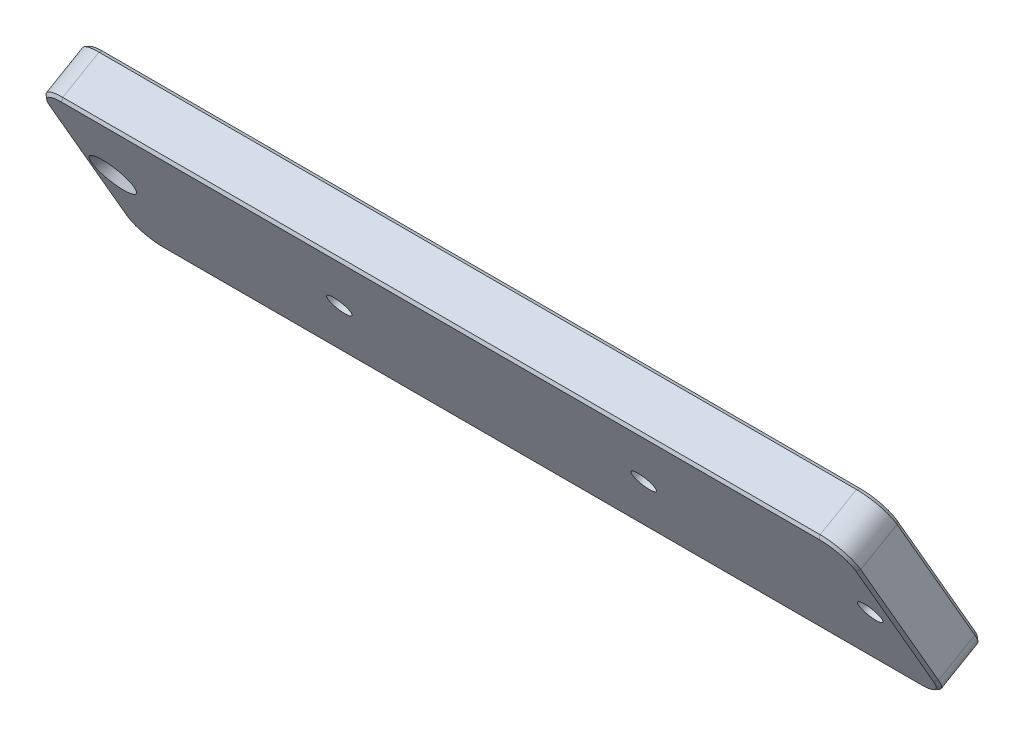
ISO-10303-21;
HEADER;
FILE_DESCRIPTION(('STEP AP214'),'2;1');
FILE_NAME('part.step','',(''),(''),'','','');
FILE_SCHEMA(('AUTOMOTIVE_DESIGN { 1 0 10303 214 1 1 1 1 }'));
ENDSEC;
DATA;
#1=APPLICATION_CONTEXT('core data for automotive mechanical design processes');
#2=APPLICATION_PROTOCOL_DEFINITION('international standard','automotive_design',2000,#1);
#3=PRODUCT_CONTEXT('',#1,'mechanical');
#4=PRODUCT('Part','Part','',(#3));
#5=PRODUCT_RELATED_PRODUCT_CATEGORY('part','',(#4));
#6=PRODUCT_DEFINITION_FORMATION('','',#4);
#7=PRODUCT_DEFINITION_CONTEXT('part definition',#1,'design');
#8=PRODUCT_DEFINITION('design','',#6,#7);
#9=PRODUCT_DEFINITION_SHAPE('','',#8);
#10=(LENGTH_UNIT() NAMED_UNIT(*) SI_UNIT(.MILLI.,.METRE.));
#11=(NAMED_UNIT(*) PLANE_ANGLE_UNIT() SI_UNIT($,.RADIAN.));
#12=(NAMED_UNIT(*) SI_UNIT($,.STERADIAN.) SOLID_ANGLE_UNIT());
#13=UNCERTAINTY_MEASURE_WITH_UNIT(LENGTH_MEASURE(1.E-05),#10,'distance_accuracy_value','');
#14=(GEOMETRIC_REPRESENTATION_CONTEXT(3) GLOBAL_UNCERTAINTY_ASSIGNED_CONTEXT((#13)) GLOBAL_UNIT_ASSIGNED_CONTEXT((#10,
#11,#12)) REPRESENTATION_CONTEXT('',''));
#15=CARTESIAN_POINT('',(0.,0.,0.));
#16=DIRECTION('',(0.,0.,1.));
#17=DIRECTION('',(1.,0.,0.));
#18=AXIS2_PLACEMENT_3D('',#15,#16,#17);
#19=CARTESIAN_POINT('',(-56.,48.490707856479,74.614170676043));
#20=DIRECTION('',(0.,-0.50000000000019,0.866025403784329));
#21=DIRECTION('',(0.,-0.866025403784329,-0.50000000000019));
#22=AXIS2_PLACEMENT_3D('',#19,#20,#21);
#23=CYLINDRICAL_SURFACE('',#22,4.);
#24=DIRECTION('',(0.,-0.50000000000019,0.866025403784329));
#25=VECTOR('',#24,1.);
#26=CARTESIAN_POINT('',(-56.,45.026606241341,72.614170676043));
#27=LINE('',#26,#25);
#28=CARTESIAN_POINT('',(-56.,44.826606241341,72.960580837557));
#29=VERTEX_POINT('',#28);
#30=CARTESIAN_POINT('',(-56.,41.7266062413414,78.3299383410167));
#31=VERTEX_POINT('',#30);
#32=EDGE_CURVE('E471',#29,#31,#27,.T.);
#33=ORIENTED_EDGE('',*,*,#32,.T.);
#34=CARTESIAN_POINT('',(-56.,45.1907078564789,80.3299383410176));
#35=DIRECTION('',(0.,-0.50000000000019,0.866025403784329));
#36=DIRECTION('',(0.,-0.866025403784329,-0.50000000000019));
#37=AXIS2_PLACEMENT_3D('',#34,#35,#36);
#38=CIRCLE('',#37,4.);
#39=CARTESIAN_POINT('',(-60.,45.1907078564789,80.3299383410176));
#40=VERTEX_POINT('',#39);
#41=EDGE_CURVE('E412',#31,#40,#38,.F.);
#42=ORIENTED_EDGE('',*,*,#41,.T.);
#43=DIRECTION('',(0.,-0.50000000000019,0.866025403784329));
#44=VECTOR('',#43,1.);
#45=CARTESIAN_POINT('',(-60.,48.490707856479,74.614170676043));
#46=LINE('',#45,#44);
#47=CARTESIAN_POINT('',(-60.,48.290707856479,74.960580837557));
#48=VERTEX_POINT('',#47);
#49=EDGE_CURVE('E479',#48,#40,#46,.T.);
#50=ORIENTED_EDGE('',*,*,#49,.F.);
#51=CARTESIAN_POINT('',(-56.,48.290707856479,74.960580837557));
#52=DIRECTION('',(0.,-0.50000000000019,0.866025403784329));
#53=DIRECTION('',(-1.,0.,0.));
#54=AXIS2_PLACEMENT_3D('',#51,#52,#53);
#55=CIRCLE('',#54,4.);
#56=EDGE_CURVE('E484',#48,#29,#55,.T.);
#57=ORIENTED_EDGE('',*,*,#56,.T.);
#58=EDGE_LOOP('',(#33,#42,#50,#57));
#59=FACE_BOUND('',#58,.T.);
#60=ADVANCED_FACE('F59',(#59),#23,.T.);
#61=CARTESIAN_POINT('',(-60.,71.873393758659,88.114170676043));
#62=DIRECTION('',(1.,0.,0.));
#63=DIRECTION('',(0.,1.,0.));
#64=AXIS2_PLACEMENT_3D('',#61,#62,#63);
#65=PLANE('',#64);
#66=ORIENTED_EDGE('',*,*,#49,.T.);
#67=DIRECTION('',(0.,0.866025403784329,0.50000000000019));
#68=VECTOR('',#67,1.);
#69=CARTESIAN_POINT('',(-60.,65.1092921435184,91.8299383410219));
#70=LINE('',#69,#68);
#71=CARTESIAN_POINT('',(-60.,65.1092921435184,91.8299383410219));
#72=VERTEX_POINT('',#71);
#73=EDGE_CURVE('E406',#40,#72,#70,.T.);
#74=ORIENTED_EDGE('',*,*,#73,.T.);
#75=DIRECTION('',(0.,-0.50000000000019,0.866025403784329));
#76=VECTOR('',#75,1.);
#77=CARTESIAN_POINT('',(-60.,68.409292143521,86.114170676043));
#78=LINE('',#77,#76);
#79=CARTESIAN_POINT('',(-60.,68.209292143521,86.460580837557));
#80=VERTEX_POINT('',#79);
#81=EDGE_CURVE('E290',#80,#72,#78,.T.);
#82=ORIENTED_EDGE('',*,*,#81,.F.);
#83=DIRECTION('',(0.,-0.866025403784329,-0.50000000000019));
#84=VECTOR('',#83,1.);
#85=CARTESIAN_POINT('',(-60.,68.209292143521,86.460580837557));
#86=LINE('',#85,#84);
#87=EDGE_CURVE('E287',#80,#48,#86,.T.);
#88=ORIENTED_EDGE('',*,*,#87,.T.);
#89=EDGE_LOOP('',(#66,#74,#82,#88));
#90=FACE_BOUND('',#89,.T.);
#91=ADVANCED_FACE('F533',(#90),#65,.F.);
#92=CARTESIAN_POINT('',(-56.,68.409292143521,86.114170676043));
#93=DIRECTION('',(0.,-0.50000000000019,0.866025403784329));
#94=DIRECTION('',(0.,0.866025403784329,0.50000000000019));
#95=AXIS2_PLACEMENT_3D('',#92,#93,#94);
#96=CYLINDRICAL_SURFACE('',#95,4.);
#97=ORIENTED_EDGE('',*,*,#81,.T.);
#98=CARTESIAN_POINT('',(-56.,65.1092921435184,91.8299383410219));
#99=DIRECTION('',(0.,-0.500000000000203,0.866025403784321));
#100=DIRECTION('',(0.,-0.866025403784321,-0.500000000000203));
#101=AXIS2_PLACEMENT_3D('',#98,#99,#100);
#102=CIRCLE('',#101,4.);
#103=CARTESIAN_POINT('',(-56.,68.5733937586559,93.8299383410228));
#104=VERTEX_POINT('',#103);
#105=EDGE_CURVE('E400',#72,#104,#102,.F.);
#106=ORIENTED_EDGE('',*,*,#105,.T.);
#107=DIRECTION('',(0.,-0.50000000000019,0.866025403784329));
#108=VECTOR('',#107,1.);
#109=CARTESIAN_POINT('',(-56.,71.873393758659,88.114170676043));
#110=LINE('',#109,#108);
#111=CARTESIAN_POINT('',(-56.,71.673393758659,88.460580837557));
#112=VERTEX_POINT('',#111);
#113=EDGE_CURVE('E339',#112,#104,#110,.T.);
#114=ORIENTED_EDGE('',*,*,#113,.F.);
#115=CARTESIAN_POINT('',(-56.,68.209292143521,86.460580837557));
#116=DIRECTION('',(0.,-0.50000000000019,0.866025403784329));
#117=DIRECTION('',(0.,0.866025403784329,0.50000000000019));
#118=AXIS2_PLACEMENT_3D('',#115,#116,#117);
#119=CIRCLE('',#118,4.);
#120=EDGE_CURVE('E238',#112,#80,#119,.T.);
#121=ORIENTED_EDGE('',*,*,#120,.T.);
#122=EDGE_LOOP('',(#97,#106,#114,#121));
#123=FACE_BOUND('',#122,.T.);
#124=ADVANCED_FACE('F540',(#123),#96,.T.);
#125=CARTESIAN_POINT('',(60.,71.873393758659,88.114170676043));
#126=DIRECTION('',(0.,-0.866025403784329,-0.50000000000019));
#127=DIRECTION('',(0.,0.50000000000019,-0.866025403784329));
#128=AXIS2_PLACEMENT_3D('',#125,#126,#127);
#129=PLANE('',#128);
#130=ORIENTED_EDGE('',*,*,#113,.T.);
#131=DIRECTION('',(1.,0.,0.));
#132=VECTOR('',#131,1.);
#133=CARTESIAN_POINT('',(56.,68.5733937586559,93.8299383410227));
#134=LINE('',#133,#132);
#135=CARTESIAN_POINT('',(56.,68.5733937586559,93.8299383410228));
#136=VERTEX_POINT('',#135);
#137=EDGE_CURVE('E361',#104,#136,#134,.T.);
#138=ORIENTED_EDGE('',*,*,#137,.T.);
#139=DIRECTION('',(0.,-0.50000000000019,0.866025403784329));
#140=VECTOR('',#139,1.);
#141=CARTESIAN_POINT('',(56.,71.873393758659,88.114170676043));
#142=LINE('',#141,#140);
#143=CARTESIAN_POINT('',(56.,71.673393758659,88.460580837557));
#144=VERTEX_POINT('',#143);
#145=EDGE_CURVE('E357',#144,#136,#142,.T.);
#146=ORIENTED_EDGE('',*,*,#145,.F.);
#147=DIRECTION('',(-1.,0.,0.));
#148=VECTOR('',#147,1.);
#149=CARTESIAN_POINT('',(56.,71.673393758659,88.460580837557));
#150=LINE('',#149,#148);
#151=EDGE_CURVE('E275',#144,#112,#150,.T.);
#152=ORIENTED_EDGE('',*,*,#151,.T.);
#153=EDGE_LOOP('',(#130,#138,#146,#152));
#154=FACE_BOUND('',#153,.T.);
#155=ADVANCED_FACE('F558',(#154),#129,.F.);
#156=CARTESIAN_POINT('',(56.,68.409292143521,86.114170676043));
#157=DIRECTION('',(0.,-0.50000000000019,0.866025403784329));
#158=DIRECTION('',(1.,0.,0.));
#159=AXIS2_PLACEMENT_3D('',#156,#157,#158);
#160=CYLINDRICAL_SURFACE('',#159,4.);
#161=ORIENTED_EDGE('',*,*,#145,.T.);
#162=CARTESIAN_POINT('',(56.,65.1092921435184,91.8299383410219));
#163=DIRECTION('',(0.,-0.500000000000203,0.866025403784321));
#164=DIRECTION('',(0.,-0.866025403784321,-0.500000000000203));
#165=AXIS2_PLACEMENT_3D('',#162,#163,#164);
#166=CIRCLE('',#165,4.);
#167=CARTESIAN_POINT('',(60.,65.1092921435184,91.8299383410219));
#168=VERTEX_POINT('',#167);
#169=EDGE_CURVE('E403',#136,#168,#166,.F.);
#170=ORIENTED_EDGE('',*,*,#169,.T.);
#171=DIRECTION('',(0.,-0.50000000000019,0.866025403784329));
#172=VECTOR('',#171,1.);
#173=CARTESIAN_POINT('',(60.,68.409292143521,86.114170676043));
#174=LINE('',#173,#172);
#175=CARTESIAN_POINT('',(60.,68.209292143521,86.460580837557));
#176=VERTEX_POINT('',#175);
#177=EDGE_CURVE('E331',#176,#168,#174,.T.);
#178=ORIENTED_EDGE('',*,*,#177,.F.);
#179=CARTESIAN_POINT('',(56.,68.209292143521,86.460580837557));
#180=DIRECTION('',(0.,-0.50000000000019,0.866025403784329));
#181=DIRECTION('',(1.,0.,0.));
#182=AXIS2_PLACEMENT_3D('',#179,#180,#181);
#183=CIRCLE('',#182,4.);
#184=EDGE_CURVE('E233',#176,#144,#183,.T.);
#185=ORIENTED_EDGE('',*,*,#184,.T.);
#186=EDGE_LOOP('',(#161,#170,#178,#185));
#187=FACE_BOUND('',#186,.T.);
#188=ADVANCED_FACE('F554',(#187),#160,.T.);
#189=CARTESIAN_POINT('',(60.,45.026606241341,72.614170676043));
#190=DIRECTION('',(-1.,0.,0.));
#191=DIRECTION('',(0.,0.,1.));
#192=AXIS2_PLACEMENT_3D('',#189,#190,#191);
#193=PLANE('',#192);
#194=ORIENTED_EDGE('',*,*,#177,.T.);
#195=DIRECTION('',(0.,-0.866025403784329,-0.50000000000019));
#196=VECTOR('',#195,1.);
#197=CARTESIAN_POINT('',(60.,45.1907078564789,80.3299383410176));
#198=LINE('',#197,#196);
#199=CARTESIAN_POINT('',(60.,45.1907078564789,80.3299383410175));
#200=VERTEX_POINT('',#199);
#201=EDGE_CURVE('E409',#168,#200,#198,.T.);
#202=ORIENTED_EDGE('',*,*,#201,.T.);
#203=DIRECTION('',(0.,-0.50000000000019,0.866025403784329));
#204=VECTOR('',#203,1.);
#205=CARTESIAN_POINT('',(60.,48.490707856479,74.614170676043));
#206=LINE('',#205,#204);
#207=CARTESIAN_POINT('',(60.,48.290707856479,74.960580837557));
#208=VERTEX_POINT('',#207);
#209=EDGE_CURVE('E279',#208,#200,#206,.T.);
#210=ORIENTED_EDGE('',*,*,#209,.F.);
#211=DIRECTION('',(0.,0.866025403784329,0.50000000000019));
#212=VECTOR('',#211,1.);
#213=CARTESIAN_POINT('',(60.,48.290707856479,74.960580837557));
#214=LINE('',#213,#212);
#215=EDGE_CURVE('E327',#208,#176,#214,.T.);
#216=ORIENTED_EDGE('',*,*,#215,.T.);
#217=EDGE_LOOP('',(#194,#202,#210,#216));
#218=FACE_BOUND('',#217,.T.);
#219=ADVANCED_FACE('F551',(#218),#193,.F.);
#220=CARTESIAN_POINT('',(56.,48.490707856479,74.614170676043));
#221=DIRECTION('',(0.,-0.50000000000019,0.866025403784329));
#222=DIRECTION('',(0.,-0.866025403784329,-0.50000000000019));
#223=AXIS2_PLACEMENT_3D('',#220,#221,#222);
#224=CYLINDRICAL_SURFACE('',#223,4.);
#225=ORIENTED_EDGE('',*,*,#209,.T.);
#226=CARTESIAN_POINT('',(56.,45.1907078564789,80.3299383410176));
#227=DIRECTION('',(0.,-0.50000000000019,0.866025403784329));
#228=DIRECTION('',(0.,-0.866025403784329,-0.50000000000019));
#229=AXIS2_PLACEMENT_3D('',#226,#227,#228);
#230=CIRCLE('',#229,4.);
#231=CARTESIAN_POINT('',(56.,41.7266062413414,78.3299383410167));
#232=VERTEX_POINT('',#231);
#233=EDGE_CURVE('E70',#200,#232,#230,.F.);
#234=ORIENTED_EDGE('',*,*,#233,.T.);
#235=DIRECTION('',(0.,-0.50000000000019,0.866025403784329));
#236=VECTOR('',#235,1.);
#237=CARTESIAN_POINT('',(56.,45.026606241341,72.614170676043));
#238=LINE('',#237,#236);
#239=CARTESIAN_POINT('',(56.,44.826606241341,72.960580837557));
#240=VERTEX_POINT('',#239);
#241=EDGE_CURVE('E468',#240,#232,#238,.T.);
#242=ORIENTED_EDGE('',*,*,#241,.F.);
#243=CARTESIAN_POINT('',(56.,48.290707856479,74.960580837557));
#244=DIRECTION('',(0.,-0.50000000000019,0.866025403784329));
#245=DIRECTION('',(0.,-0.866025403784329,-0.50000000000019));
#246=AXIS2_PLACEMENT_3D('',#243,#244,#245);
#247=CIRCLE('',#246,4.);
#248=EDGE_CURVE('E269',#240,#208,#247,.T.);
#249=ORIENTED_EDGE('',*,*,#248,.T.);
#250=EDGE_LOOP('',(#225,#234,#242,#249));
#251=FACE_BOUND('',#250,.T.);
#252=ADVANCED_FACE('F548',(#251),#224,.T.);
#253=CARTESIAN_POINT('',(-60.,45.026606241341,72.614170676043));
#254=DIRECTION('',(0.,0.866025403784329,0.50000000000019));
#255=DIRECTION('',(1.,0.,0.));
#256=AXIS2_PLACEMENT_3D('',#253,#254,#255);
#257=PLANE('',#256);
#258=ORIENTED_EDGE('',*,*,#241,.T.);
#259=DIRECTION('',(-1.,0.,0.));
#260=VECTOR('',#259,1.);
#261=CARTESIAN_POINT('',(-56.,41.7266062413414,78.3299383410167));
#262=LINE('',#261,#260);
#263=EDGE_CURVE('E12',#232,#31,#262,.T.);
#264=ORIENTED_EDGE('',*,*,#263,.T.);
#265=ORIENTED_EDGE('',*,*,#32,.F.);
#266=DIRECTION('',(1.,0.,0.));
#267=VECTOR('',#266,1.);
#268=CARTESIAN_POINT('',(-56.,44.826606241341,72.960580837557));
#269=LINE('',#268,#267);
#270=EDGE_CURVE('E465',#29,#240,#269,.T.);
#271=ORIENTED_EDGE('',*,*,#270,.T.);
#272=EDGE_LOOP('',(#258,#264,#265,#271));
#273=FACE_BOUND('',#272,.T.);
#274=ADVANCED_FACE('F546',(#273),#257,.F.);
#275=CARTESIAN_POINT('',(22.5,58.45,80.364170676043));
#276=DIRECTION('',(0.,-0.50000000000019,0.866025403784329));
#277=DIRECTION('',(-1.,0.,0.));
#278=AXIS2_PLACEMENT_3D('',#275,#276,#277);
#279=CYLINDRICAL_SURFACE('',#278,1.7);
#280=DIRECTION('',(0.,-0.50000000000019,0.866025403784329));
#281=VECTOR('',#280,1.);
#282=CARTESIAN_POINT('',(20.8,58.45,80.364170676043));
#283=LINE('',#282,#281);
#284=CARTESIAN_POINT('',(20.8,57.65,81.749811322098));
#285=VERTEX_POINT('',#284);
#286=CARTESIAN_POINT('',(20.8,54.9499999999986,86.4263485025335));
#287=VERTEX_POINT('',#286);
#288=EDGE_CURVE('E356',#285,#287,#283,.T.);
#289=ORIENTED_EDGE('',*,*,#288,.T.);
#290=CARTESIAN_POINT('',(22.5,54.9499999999986,86.4263485025335));
#291=DIRECTION('',(0.,-0.50000000000019,0.866025403784329));
#292=DIRECTION('',(0.,-0.866025403784329,-0.50000000000019));
#293=AXIS2_PLACEMENT_3D('',#290,#291,#292);
#294=CIRCLE('',#293,1.7);
#295=EDGE_CURVE('E365',#287,#287,#294,.T.);
#296=ORIENTED_EDGE('',*,*,#295,.T.);
#297=ORIENTED_EDGE('',*,*,#288,.F.);
#298=CARTESIAN_POINT('',(22.5,57.65,81.749811322098));
#299=DIRECTION('',(0.,-0.50000000000019,0.866025403784329));
#300=DIRECTION('',(0.,-0.866025403784329,-0.50000000000019));
#301=AXIS2_PLACEMENT_3D('',#298,#299,#300);
#302=CIRCLE('',#301,1.7);
#303=EDGE_CURVE('E326',#285,#285,#302,.T.);
#304=ORIENTED_EDGE('',*,*,#303,.F.);
#305=EDGE_LOOP('',(#289,#296,#297,#304));
#306=FACE_BOUND('',#305,.T.);
#307=ADVANCED_FACE('F544',(#306),#279,.F.);
#308=CARTESIAN_POINT('',(-22.5,58.45,80.364170676043));
#309=DIRECTION('',(0.,-0.50000000000019,0.866025403784329));
#310=DIRECTION('',(-1.,0.,0.));
#311=AXIS2_PLACEMENT_3D('',#308,#309,#310);
#312=CYLINDRICAL_SURFACE('',#311,1.7);
#313=DIRECTION('',(0.,-0.50000000000019,0.866025403784329));
#314=VECTOR('',#313,1.);
#315=CARTESIAN_POINT('',(-24.2,58.45,80.364170676043));
#316=LINE('',#315,#314);
#317=CARTESIAN_POINT('',(-24.2,57.65,81.749811322098));
#318=VERTEX_POINT('',#317);
#319=CARTESIAN_POINT('',(-24.2,54.9499999999986,86.4263485025335));
#320=VERTEX_POINT('',#319);
#321=EDGE_CURVE('E325',#318,#320,#316,.T.);
#322=ORIENTED_EDGE('',*,*,#321,.T.);
#323=CARTESIAN_POINT('',(-22.5,54.9499999999986,86.4263485025335));
#324=DIRECTION('',(0.,-0.50000000000019,0.866025403784329));
#325=DIRECTION('',(0.,-0.866025403784329,-0.50000000000019));
#326=AXIS2_PLACEMENT_3D('',#323,#324,#325);
#327=CIRCLE('',#326,1.7);
#328=EDGE_CURVE('E314',#320,#320,#327,.T.);
#329=ORIENTED_EDGE('',*,*,#328,.T.);
#330=ORIENTED_EDGE('',*,*,#321,.F.);
#331=CARTESIAN_POINT('',(-22.5,57.65,81.749811322098));
#332=DIRECTION('',(0.,-0.50000000000019,0.866025403784329));
#333=DIRECTION('',(0.,-0.866025403784329,-0.50000000000019));
#334=AXIS2_PLACEMENT_3D('',#331,#332,#333);
#335=CIRCLE('',#334,1.7);
#336=EDGE_CURVE('E274',#318,#318,#335,.T.);
#337=ORIENTED_EDGE('',*,*,#336,.F.);
#338=EDGE_LOOP('',(#322,#329,#330,#337));
#339=FACE_BOUND('',#338,.T.);
#340=ADVANCED_FACE('F511',(#339),#312,.F.);
#341=CARTESIAN_POINT('',(56.,56.45,83.828272291181));
#342=DIRECTION('',(0.,0.50000000000019,-0.866025403784329));
#343=DIRECTION('',(-1.,0.,0.));
#344=AXIS2_PLACEMENT_3D('',#341,#342,#343);
#345=CYLINDRICAL_SURFACE('',#344,1.7);
#346=DIRECTION('',(0.,0.50000000000019,-0.866025403784329));
#347=VECTOR('',#346,1.);
#348=CARTESIAN_POINT('',(54.3,56.45,83.828272291181));
#349=LINE('',#348,#347);
#350=CARTESIAN_POINT('',(54.3,54.9499999999994,86.426348502534));
#351=VERTEX_POINT('',#350);
#352=CARTESIAN_POINT('',(54.3,58.45,80.364170676043));
#353=VERTEX_POINT('',#352);
#354=EDGE_CURVE('E322',#351,#353,#349,.T.);
#355=ORIENTED_EDGE('',*,*,#354,.F.);
#356=CARTESIAN_POINT('',(56.,54.9499999999994,86.426348502534));
#357=DIRECTION('',(0.,-0.50000000000019,0.866025403784329));
#358=DIRECTION('',(0.,-0.866025403784329,-0.50000000000019));
#359=AXIS2_PLACEMENT_3D('',#356,#357,#358);
#360=CIRCLE('',#359,1.7);
#361=EDGE_CURVE('E332',#351,#351,#360,.F.);
#362=ORIENTED_EDGE('',*,*,#361,.F.);
#363=ORIENTED_EDGE('',*,*,#354,.T.);
#364=CARTESIAN_POINT('',(56.,58.45,80.364170676043));
#365=DIRECTION('',(0.,0.50000000000019,-0.866025403784329));
#366=DIRECTION('',(-1.,0.,0.));
#367=AXIS2_PLACEMENT_3D('',#364,#365,#366);
#368=CIRCLE('',#367,1.7);
#369=EDGE_CURVE('E308',#353,#353,#368,.T.);
#370=ORIENTED_EDGE('',*,*,#369,.T.);
#371=EDGE_LOOP('',(#355,#362,#363,#370));
#372=FACE_BOUND('',#371,.T.);
#373=ADVANCED_FACE('F679',(#372),#345,.F.);
#374=CARTESIAN_POINT('',(22.5,58.45,80.364170676043));
#375=DIRECTION('',(0.,0.50000000000019,-0.866025403784329));
#376=DIRECTION('',(-1.,0.,0.));
#377=AXIS2_PLACEMENT_3D('',#374,#375,#376);
#378=CONICAL_SURFACE('',#377,3.3,0.785398163397);
#379=DIRECTION('',(0.707106781186753,-0.353553390592877,0.612372435695786));
#380=VECTOR('',#379,1.);
#381=CARTESIAN_POINT('',(19.2,58.45,80.364170676043));
#382=LINE('',#381,#380);
#383=CARTESIAN_POINT('',(19.2,58.45,80.364170676043));
#384=VERTEX_POINT('',#383);
#385=EDGE_CURVE('E318',#384,#285,#382,.T.);
#386=ORIENTED_EDGE('',*,*,#385,.F.);
#387=CARTESIAN_POINT('',(22.5,58.45,80.364170676043));
#388=DIRECTION('',(0.,-0.50000000000019,0.866025403784329));
#389=DIRECTION('',(-1.,0.,0.));
#390=AXIS2_PLACEMENT_3D('',#387,#388,#389);
#391=CIRCLE('',#390,3.3);
#392=EDGE_CURVE('E304',#384,#384,#391,.T.);
#393=ORIENTED_EDGE('',*,*,#392,.F.);
#394=ORIENTED_EDGE('',*,*,#385,.T.);
#395=ORIENTED_EDGE('',*,*,#303,.T.);
#396=EDGE_LOOP('',(#386,#393,#394,#395));
#397=FACE_BOUND('',#396,.T.);
#398=ADVANCED_FACE('F497',(#397),#378,.F.);
#399=CARTESIAN_POINT('',(-22.5,58.45,80.364170676043));
#400=DIRECTION('',(0.,0.50000000000019,-0.866025403784329));
#401=DIRECTION('',(-1.,0.,0.));
#402=AXIS2_PLACEMENT_3D('',#399,#400,#401);
#403=CONICAL_SURFACE('',#402,3.3,0.785398163397);
#404=DIRECTION('',(0.707106781186753,-0.353553390592877,0.612372435695786));
#405=VECTOR('',#404,1.);
#406=CARTESIAN_POINT('',(-25.8,58.45,80.364170676043));
#407=LINE('',#406,#405);
#408=CARTESIAN_POINT('',(-25.8,58.45,80.364170676043));
#409=VERTEX_POINT('',#408);
#410=EDGE_CURVE('E270',#409,#318,#407,.T.);
#411=ORIENTED_EDGE('',*,*,#410,.F.);
#412=CARTESIAN_POINT('',(-22.5,58.45,80.364170676043));
#413=DIRECTION('',(0.,-0.50000000000019,0.866025403784329));
#414=DIRECTION('',(-1.,0.,0.));
#415=AXIS2_PLACEMENT_3D('',#412,#413,#414);
#416=CIRCLE('',#415,3.3);
#417=EDGE_CURVE('E293',#409,#409,#416,.T.);
#418=ORIENTED_EDGE('',*,*,#417,.F.);
#419=ORIENTED_EDGE('',*,*,#410,.T.);
#420=ORIENTED_EDGE('',*,*,#336,.T.);
#421=EDGE_LOOP('',(#411,#418,#419,#420));
#422=FACE_BOUND('',#421,.T.);
#423=ADVANCED_FACE('F508',(#422),#403,.F.);
#424=CARTESIAN_POINT('',(56.,71.600188677902,88.1873757568));
#425=DIRECTION('',(0.,0.965925826288944,-0.258819045102985));
#426=DIRECTION('',(-1.,0.,0.));
#427=AXIS2_PLACEMENT_3D('',#424,#425,#426);
#428=PLANE('',#427);
#429=DIRECTION('',(-1.,0.,0.));
#430=VECTOR('',#429,1.);
#431=CARTESIAN_POINT('',(56.,71.526983597145,87.914170676043));
#432=LINE('',#431,#430);
#433=CARTESIAN_POINT('',(56.,71.526983597145,87.914170676043));
#434=VERTEX_POINT('',#433);
#435=CARTESIAN_POINT('',(-56.,71.526983597145,87.914170676043));
#436=VERTEX_POINT('',#435);
#437=EDGE_CURVE('E254',#434,#436,#432,.T.);
#438=ORIENTED_EDGE('',*,*,#437,.T.);
#439=DIRECTION('',(0.,-0.258819045102985,-0.965925826288944));
#440=VECTOR('',#439,1.);
#441=CARTESIAN_POINT('',(-56.,71.600188677902,88.1873757568));
#442=LINE('',#441,#440);
#443=EDGE_CURVE('E237',#112,#436,#442,.T.);
#444=ORIENTED_EDGE('',*,*,#443,.F.);
#445=ORIENTED_EDGE('',*,*,#151,.F.);
#446=DIRECTION('',(0.,-0.258819045102985,-0.965925826288944));
#447=VECTOR('',#446,1.);
#448=CARTESIAN_POINT('',(56.,71.673393758659,88.460580837557));
#449=LINE('',#448,#447);
#450=EDGE_CURVE('E319',#144,#434,#449,.T.);
#451=ORIENTED_EDGE('',*,*,#450,.T.);
#452=EDGE_LOOP('',(#438,#444,#445,#451));
#453=FACE_BOUND('',#452,.T.);
#454=ADVANCED_FACE('F590',(#453),#428,.T.);
#455=CARTESIAN_POINT('',(56.,68.209292143521,86.460580837557));
#456=DIRECTION('',(0.,-0.50000000000019,0.866025403784329));
#457=DIRECTION('',(1.,0.,0.));
#458=AXIS2_PLACEMENT_3D('',#455,#456,#457);
#459=CONICAL_SURFACE('',#458,4.,0.785398163397);
#460=CARTESIAN_POINT('',(56.,68.409292143521,86.114170676043));
#461=DIRECTION('',(0.,-0.50000000000019,0.866025403784329));
#462=DIRECTION('',(1.,0.,0.));
#463=AXIS2_PLACEMENT_3D('',#460,#461,#462);
#464=CIRCLE('',#463,3.6);
#465=CARTESIAN_POINT('',(59.6,68.409292143521,86.114170676043));
#466=VERTEX_POINT('',#465);
#467=EDGE_CURVE('E230',#466,#434,#464,.T.);
#468=ORIENTED_EDGE('',*,*,#467,.T.);
#469=ORIENTED_EDGE('',*,*,#450,.F.);
#470=ORIENTED_EDGE('',*,*,#184,.F.);
#471=DIRECTION('',(-0.707106781186753,0.353553390592877,-0.612372435695786));
#472=VECTOR('',#471,1.);
#473=CARTESIAN_POINT('',(59.8,68.309292143521,86.2873757568));
#474=LINE('',#473,#472);
#475=EDGE_CURVE('E225',#176,#466,#474,.T.);
#476=ORIENTED_EDGE('',*,*,#475,.T.);
#477=EDGE_LOOP('',(#468,#469,#470,#476));
#478=FACE_BOUND('',#477,.T.);
#479=ADVANCED_FACE('F227',(#478),#459,.T.);
#480=CARTESIAN_POINT('',(-56.,68.209292143521,86.460580837557));
#481=DIRECTION('',(0.,-0.50000000000019,0.866025403784329));
#482=DIRECTION('',(0.,0.866025403784329,0.50000000000019));
#483=AXIS2_PLACEMENT_3D('',#480,#481,#482);
#484=CONICAL_SURFACE('',#483,4.,0.785398163397);
#485=CARTESIAN_POINT('',(-56.,68.409292143521,86.114170676043));
#486=DIRECTION('',(0.,-0.50000000000019,0.866025403784329));
#487=DIRECTION('',(0.,0.866025403784329,0.50000000000019));
#488=AXIS2_PLACEMENT_3D('',#485,#486,#487);
#489=CIRCLE('',#488,3.6);
#490=CARTESIAN_POINT('',(-59.6,68.409292143521,86.114170676043));
#491=VERTEX_POINT('',#490);
#492=EDGE_CURVE('E259',#436,#491,#489,.T.);
#493=ORIENTED_EDGE('',*,*,#492,.T.);
#494=DIRECTION('',(0.707106781186753,0.353553390592877,-0.612372435695786));
#495=VECTOR('',#494,1.);
#496=CARTESIAN_POINT('',(-60.,68.209292143521,86.460580837557));
#497=LINE('',#496,#495);
#498=EDGE_CURVE('E336',#80,#491,#497,.T.);
#499=ORIENTED_EDGE('',*,*,#498,.F.);
#500=ORIENTED_EDGE('',*,*,#120,.F.);
#501=ORIENTED_EDGE('',*,*,#443,.T.);
#502=EDGE_LOOP('',(#493,#499,#500,#501));
#503=FACE_BOUND('',#502,.T.);
#504=ADVANCED_FACE('F593',(#503),#484,.T.);
#505=CARTESIAN_POINT('',(59.8,48.390707856479,74.7873757568));
#506=DIRECTION('',(0.707106781186753,0.353553390592877,-0.612372435695786));
#507=DIRECTION('',(0.,-0.866025403784679,-0.499999999999584));
#508=AXIS2_PLACEMENT_3D('',#505,#506,#507);
#509=PLANE('',#508);
#510=DIRECTION('',(0.,0.866025403784329,0.50000000000019));
#511=VECTOR('',#510,1.);
#512=CARTESIAN_POINT('',(59.6,48.490707856479,74.614170676043));
#513=LINE('',#512,#511);
#514=CARTESIAN_POINT('',(59.6,48.490707856479,74.614170676043));
#515=VERTEX_POINT('',#514);
#516=EDGE_CURVE('E241',#515,#466,#513,.T.);
#517=ORIENTED_EDGE('',*,*,#516,.T.);
#518=ORIENTED_EDGE('',*,*,#475,.F.);
#519=ORIENTED_EDGE('',*,*,#215,.F.);
#520=DIRECTION('',(-0.707106781186753,0.353553390592877,-0.612372435695786));
#521=VECTOR('',#520,1.);
#522=CARTESIAN_POINT('',(60.,48.290707856479,74.960580837557));
#523=LINE('',#522,#521);
#524=EDGE_CURVE('E244',#208,#515,#523,.T.);
#525=ORIENTED_EDGE('',*,*,#524,.T.);
#526=EDGE_LOOP('',(#517,#518,#519,#525));
#527=FACE_BOUND('',#526,.T.);
#528=ADVANCED_FACE('F242',(#527),#509,.T.);
#529=CARTESIAN_POINT('',(-59.8,68.309292143521,86.2873757568));
#530=DIRECTION('',(-0.707106781186753,0.353553390592877,-0.612372435695786));
#531=DIRECTION('',(-0.654653670707863,0.,0.755928946018553));
#532=AXIS2_PLACEMENT_3D('',#529,#530,#531);
#533=PLANE('',#532);
#534=DIRECTION('',(0.,-0.866025403784329,-0.50000000000019));
#535=VECTOR('',#534,1.);
#536=CARTESIAN_POINT('',(-59.6,68.409292143521,86.114170676043));
#537=LINE('',#536,#535);
#538=CARTESIAN_POINT('',(-59.6,48.490707856479,74.614170676043));
#539=VERTEX_POINT('',#538);
#540=EDGE_CURVE('E297',#491,#539,#537,.T.);
#541=ORIENTED_EDGE('',*,*,#540,.T.);
#542=DIRECTION('',(0.707106781186753,0.353553390592877,-0.612372435695786));
#543=VECTOR('',#542,1.);
#544=CARTESIAN_POINT('',(-59.8,48.390707856479,74.7873757568));
#545=LINE('',#544,#543);
#546=EDGE_CURVE('E283',#48,#539,#545,.T.);
#547=ORIENTED_EDGE('',*,*,#546,.F.);
#548=ORIENTED_EDGE('',*,*,#87,.F.);
#549=ORIENTED_EDGE('',*,*,#498,.T.);
#550=EDGE_LOOP('',(#541,#547,#548,#549));
#551=FACE_BOUND('',#550,.T.);
#552=ADVANCED_FACE('F516',(#551),#533,.T.);
#553=CARTESIAN_POINT('',(0.,54.9499999999994,86.426348502534));
#554=DIRECTION('',(0.,-0.50000000000019,0.866025403784329));
#555=DIRECTION('',(-1.,0.,0.));
#556=AXIS2_PLACEMENT_3D('',#553,#554,#555);
#557=PLANE('',#556);
#558=CARTESIAN_POINT('',(56.,64.9092921435183,92.1763485025356));
#559=DIRECTION('',(0.,-0.50000000000019,0.866025403784329));
#560=DIRECTION('',(0.,-0.866025403784329,-0.50000000000019));
#561=AXIS2_PLACEMENT_3D('',#558,#559,#560);
#562=CIRCLE('',#561,3.60000000000002);
#563=CARTESIAN_POINT('',(59.6,64.9092921435183,92.1763485025356));
#564=VERTEX_POINT('',#563);
#565=CARTESIAN_POINT('',(56.,68.0269835971419,93.9763485025363));
#566=VERTEX_POINT('',#565);
#567=EDGE_CURVE('E390',#564,#566,#562,.T.);
#568=ORIENTED_EDGE('',*,*,#567,.T.);
#569=DIRECTION('',(-1.,0.,0.));
#570=VECTOR('',#569,1.);
#571=CARTESIAN_POINT('',(-56.,68.0269835971421,93.9763485025364));
#572=LINE('',#571,#570);
#573=CARTESIAN_POINT('',(-56.,68.0269835971419,93.9763485025363));
#574=VERTEX_POINT('',#573);
#575=EDGE_CURVE('E396',#566,#574,#572,.T.);
#576=ORIENTED_EDGE('',*,*,#575,.T.);
#577=CARTESIAN_POINT('',(-56.,64.9092921435183,92.1763485025356));
#578=DIRECTION('',(0.,-0.50000000000019,0.866025403784329));
#579=DIRECTION('',(0.,-0.866025403784329,-0.50000000000019));
#580=AXIS2_PLACEMENT_3D('',#577,#578,#579);
#581=CIRCLE('',#580,3.59999999999997);
#582=CARTESIAN_POINT('',(-59.6,64.9092921435183,92.1763485025356));
#583=VERTEX_POINT('',#582);
#584=EDGE_CURVE('E393',#574,#583,#581,.T.);
#585=ORIENTED_EDGE('',*,*,#584,.T.);
#586=DIRECTION('',(0.,-0.866025403784329,-0.50000000000019));
#587=VECTOR('',#586,1.);
#588=CARTESIAN_POINT('',(-59.6,44.9907078564788,80.6763485025313));
#589=LINE('',#588,#587);
#590=CARTESIAN_POINT('',(-59.6,44.9907078564788,80.6763485025313));
#591=VERTEX_POINT('',#590);
#592=EDGE_CURVE('E387',#583,#591,#589,.T.);
#593=ORIENTED_EDGE('',*,*,#592,.T.);
#594=CARTESIAN_POINT('',(-56.,44.9907078564788,80.6763485025313));
#595=DIRECTION('',(0.,-0.50000000000019,0.866025403784329));
#596=DIRECTION('',(0.,-0.866025403784329,-0.50000000000019));
#597=AXIS2_PLACEMENT_3D('',#594,#595,#596);
#598=CIRCLE('',#597,3.59999999999998);
#599=CARTESIAN_POINT('',(-56.,41.8730164028551,78.8763485025305));
#600=VERTEX_POINT('',#599);
#601=EDGE_CURVE('E381',#591,#600,#598,.T.);
#602=ORIENTED_EDGE('',*,*,#601,.T.);
#603=DIRECTION('',(1.,0.,0.));
#604=VECTOR('',#603,1.);
#605=CARTESIAN_POINT('',(56.,41.8730164028551,78.8763485025305));
#606=LINE('',#605,#604);
#607=CARTESIAN_POINT('',(56.,41.8730164028551,78.8763485025305));
#608=VERTEX_POINT('',#607);
#609=EDGE_CURVE('E375',#600,#608,#606,.T.);
#610=ORIENTED_EDGE('',*,*,#609,.T.);
#611=CARTESIAN_POINT('',(56.,44.9907078564788,80.6763485025313));
#612=DIRECTION('',(0.,-0.50000000000019,0.866025403784329));
#613=DIRECTION('',(0.,-0.866025403784329,-0.50000000000019));
#614=AXIS2_PLACEMENT_3D('',#611,#612,#613);
#615=CIRCLE('',#614,3.59999999999997);
#616=CARTESIAN_POINT('',(59.6,44.9907078564788,80.6763485025313));
#617=VERTEX_POINT('',#616);
#618=EDGE_CURVE('E378',#608,#617,#615,.T.);
#619=ORIENTED_EDGE('',*,*,#618,.T.);
#620=DIRECTION('',(0.,0.866025403784329,0.50000000000019));
#621=VECTOR('',#620,1.);
#622=CARTESIAN_POINT('',(59.6,64.9092921435183,92.1763485025356));
#623=LINE('',#622,#621);
#624=EDGE_CURVE('E384',#617,#564,#623,.T.);
#625=ORIENTED_EDGE('',*,*,#624,.T.);
#626=EDGE_LOOP('',(#568,#576,#585,#593,#602,#610,#619,#625));
#627=FACE_BOUND('',#626,.T.);
#628=CARTESIAN_POINT('',(-56.,54.9499999999986,86.4263485025335));
#629=DIRECTION('',(0.,-0.50000000000019,0.866025403784329));
#630=DIRECTION('',(0.,-0.866025403784329,-0.50000000000019));
#631=AXIS2_PLACEMENT_3D('',#628,#629,#630);
#632=CIRCLE('',#631,3.15);
#633=CARTESIAN_POINT('',(-56.,52.2220199780779,84.8513485025329));
#634=VERTEX_POINT('',#633);
#635=EDGE_CURVE('E446',#634,#634,#632,.T.);
#636=ORIENTED_EDGE('',*,*,#635,.F.);
#637=EDGE_LOOP('',(#636));
#638=FACE_BOUND('',#637,.T.);
#639=ORIENTED_EDGE('',*,*,#361,.T.);
#640=EDGE_LOOP('',(#639));
#641=FACE_BOUND('',#640,.T.);
#642=ORIENTED_EDGE('',*,*,#295,.F.);
#643=EDGE_LOOP('',(#642));
#644=FACE_BOUND('',#643,.T.);
#645=ORIENTED_EDGE('',*,*,#328,.F.);
#646=EDGE_LOOP('',(#645));
#647=FACE_BOUND('',#646,.T.);
#648=ADVANCED_FACE('F514',(#627,#638,#641,#644,#647),#557,.T.);
#649=CARTESIAN_POINT('',(56.,48.290707856479,74.960580837557));
#650=DIRECTION('',(0.,-0.50000000000019,0.866025403784329));
#651=DIRECTION('',(0.,-0.866025403784329,-0.50000000000019));
#652=AXIS2_PLACEMENT_3D('',#649,#650,#651);
#653=CONICAL_SURFACE('',#652,4.,0.785398163397);
#654=CARTESIAN_POINT('',(56.,48.490707856479,74.614170676043));
#655=DIRECTION('',(0.,-0.50000000000019,0.866025403784329));
#656=DIRECTION('',(0.,-0.866025403784329,-0.50000000000019));
#657=AXIS2_PLACEMENT_3D('',#654,#655,#656);
#658=CIRCLE('',#657,3.6);
#659=CARTESIAN_POINT('',(56.,45.373016402855,72.814170676043));
#660=VERTEX_POINT('',#659);
#661=EDGE_CURVE('E248',#660,#515,#658,.T.);
#662=ORIENTED_EDGE('',*,*,#661,.T.);
#663=ORIENTED_EDGE('',*,*,#524,.F.);
#664=ORIENTED_EDGE('',*,*,#248,.F.);
#665=DIRECTION('',(0.,0.965925826288944,-0.258819045102985));
#666=VECTOR('',#665,1.);
#667=CARTESIAN_POINT('',(56.,45.099811322098,72.8873757568));
#668=LINE('',#667,#666);
#669=EDGE_CURVE('E263',#240,#660,#668,.T.);
#670=ORIENTED_EDGE('',*,*,#669,.T.);
#671=EDGE_LOOP('',(#662,#663,#664,#670));
#672=FACE_BOUND('',#671,.T.);
#673=ADVANCED_FACE('F503',(#672),#653,.T.);
#674=CARTESIAN_POINT('',(0.,58.45,80.364170676043));
#675=DIRECTION('',(0.,-0.50000000000019,0.866025403784329));
#676=DIRECTION('',(-1.,0.,0.));
#677=AXIS2_PLACEMENT_3D('',#674,#675,#676);
#678=PLANE('',#677);
#679=CARTESIAN_POINT('',(-56.,58.45,80.364170676043));
#680=DIRECTION('',(0.,-0.50000000000019,0.866025403784329));
#681=DIRECTION('',(0.,-0.866025403784329,-0.50000000000019));
#682=AXIS2_PLACEMENT_3D('',#679,#680,#681);
#683=CIRCLE('',#682,1.8);
#684=CARTESIAN_POINT('',(-56.,56.8911542731882,79.4641706760427));
#685=VERTEX_POINT('',#684);
#686=EDGE_CURVE('E459',#685,#685,#683,.T.);
#687=ORIENTED_EDGE('',*,*,#686,.T.);
#688=EDGE_LOOP('',(#687));
#689=FACE_BOUND('',#688,.T.);
#690=ORIENTED_EDGE('',*,*,#369,.F.);
#691=EDGE_LOOP('',(#690));
#692=FACE_BOUND('',#691,.T.);
#693=ORIENTED_EDGE('',*,*,#392,.T.);
#694=EDGE_LOOP('',(#693));
#695=FACE_BOUND('',#694,.T.);
#696=ORIENTED_EDGE('',*,*,#417,.T.);
#697=EDGE_LOOP('',(#696));
#698=FACE_BOUND('',#697,.T.);
#699=CARTESIAN_POINT('',(-56.,48.490707856479,74.614170676043));
#700=DIRECTION('',(0.,-0.50000000000019,0.866025403784329));
#701=DIRECTION('',(-1.,0.,0.));
#702=AXIS2_PLACEMENT_3D('',#699,#700,#701);
#703=CIRCLE('',#702,3.6);
#704=CARTESIAN_POINT('',(-56.,45.373016402855,72.814170676043));
#705=VERTEX_POINT('',#704);
#706=EDGE_CURVE('E280',#539,#705,#703,.T.);
#707=ORIENTED_EDGE('',*,*,#706,.F.);
#708=ORIENTED_EDGE('',*,*,#540,.F.);
#709=ORIENTED_EDGE('',*,*,#492,.F.);
#710=ORIENTED_EDGE('',*,*,#437,.F.);
#711=ORIENTED_EDGE('',*,*,#467,.F.);
#712=ORIENTED_EDGE('',*,*,#516,.F.);
#713=ORIENTED_EDGE('',*,*,#661,.F.);
#714=DIRECTION('',(1.,0.,0.));
#715=VECTOR('',#714,1.);
#716=CARTESIAN_POINT('',(-56.,45.373016402855,72.814170676043));
#717=LINE('',#716,#715);
#718=EDGE_CURVE('E480',#705,#660,#717,.T.);
#719=ORIENTED_EDGE('',*,*,#718,.F.);
#720=EDGE_LOOP('',(#707,#708,#709,#710,#711,#712,#713,#719));
#721=FACE_BOUND('',#720,.T.);
#722=ADVANCED_FACE('F251',(#689,#692,#695,#698,#721),#678,.F.);
#723=CARTESIAN_POINT('',(-56.,48.290707856479,74.960580837557));
#724=DIRECTION('',(0.,-0.50000000000019,0.866025403784329));
#725=DIRECTION('',(-1.,0.,0.));
#726=AXIS2_PLACEMENT_3D('',#723,#724,#725);
#727=CONICAL_SURFACE('',#726,4.,0.785398163397);
#728=ORIENTED_EDGE('',*,*,#706,.T.);
#729=DIRECTION('',(0.,0.965925826288944,-0.258819045102985));
#730=VECTOR('',#729,1.);
#731=CARTESIAN_POINT('',(-56.,45.099811322098,72.8873757568));
#732=LINE('',#731,#730);
#733=EDGE_CURVE('E265',#29,#705,#732,.T.);
#734=ORIENTED_EDGE('',*,*,#733,.F.);
#735=ORIENTED_EDGE('',*,*,#56,.F.);
#736=ORIENTED_EDGE('',*,*,#546,.T.);
#737=EDGE_LOOP('',(#728,#734,#735,#736));
#738=FACE_BOUND('',#737,.T.);
#739=ADVANCED_FACE('F502',(#738),#727,.T.);
#740=CARTESIAN_POINT('',(-56.,45.099811322098,72.8873757568));
#741=DIRECTION('',(0.,-0.258819045102985,-0.965925826288944));
#742=DIRECTION('',(0.,-0.965925826288944,0.258819045102985));
#743=AXIS2_PLACEMENT_3D('',#740,#741,#742);
#744=PLANE('',#743);
#745=ORIENTED_EDGE('',*,*,#718,.T.);
#746=ORIENTED_EDGE('',*,*,#669,.F.);
#747=ORIENTED_EDGE('',*,*,#270,.F.);
#748=ORIENTED_EDGE('',*,*,#733,.T.);
#749=EDGE_LOOP('',(#745,#746,#747,#748));
#750=FACE_BOUND('',#749,.T.);
#751=ADVANCED_FACE('F656',(#750),#744,.T.);
#752=CARTESIAN_POINT('',(-56.,54.9499999999986,86.4263485025335));
#753=DIRECTION('',(0.,-0.50000000000019,0.866025403784329));
#754=DIRECTION('',(0.,-0.866025403784329,-0.50000000000019));
#755=AXIS2_PLACEMENT_3D('',#752,#753,#754);
#756=CYLINDRICAL_SURFACE('',#755,1.8);
#757=ORIENTED_EDGE('',*,*,#686,.F.);
#758=EDGE_LOOP('',(#757));
#759=FACE_BOUND('',#758,.T.);
#760=CARTESIAN_POINT('',(-56.,55.6249999999988,85.2572142074247));
#761=DIRECTION('',(0.,-0.50000000000019,0.866025403784329));
#762=DIRECTION('',(0.,-0.866025403784329,-0.50000000000019));
#763=AXIS2_PLACEMENT_3D('',#760,#761,#762);
#764=CIRCLE('',#763,1.8);
#765=CARTESIAN_POINT('',(-56.,54.0661542731871,84.3572142074243));
#766=VERTEX_POINT('',#765);
#767=EDGE_CURVE('E453',#766,#766,#764,.T.);
#768=ORIENTED_EDGE('',*,*,#767,.T.);
#769=EDGE_LOOP('',(#768));
#770=FACE_BOUND('',#769,.T.);
#771=ADVANCED_FACE('F650',(#759,#770),#756,.F.);
#772=CARTESIAN_POINT('',(-56.,54.9499999999986,86.4263485025335));
#773=DIRECTION('',(0.,-0.50000000000019,0.866025403784329));
#774=DIRECTION('',(0.,-0.866025403784329,-0.50000000000019));
#775=AXIS2_PLACEMENT_3D('',#772,#773,#774);
#776=CONICAL_SURFACE('',#775,3.15,0.78539816339745);
#777=ORIENTED_EDGE('',*,*,#767,.F.);
#778=EDGE_LOOP('',(#777));
#779=FACE_BOUND('',#778,.T.);
#780=ORIENTED_EDGE('',*,*,#635,.T.);
#781=EDGE_LOOP('',(#780));
#782=FACE_BOUND('',#781,.T.);
#783=ADVANCED_FACE('F647',(#779,#782),#776,.F.);
#784=CARTESIAN_POINT('',(-60.,41.7266062413414,78.3299383410167));
#785=DIRECTION('',(0.,-0.965925826289124,0.258819045102312));
#786=DIRECTION('',(1.,0.,0.));
#787=AXIS2_PLACEMENT_3D('',#784,#785,#786);
#788=PLANE('',#787);
#789=DIRECTION('',(0.,-0.258819045102312,-0.965925826289124));
#790=VECTOR('',#789,1.);
#791=CARTESIAN_POINT('',(56.,41.8730164028551,78.8763485025305));
#792=LINE('',#791,#790);
#793=EDGE_CURVE('E438',#608,#232,#792,.T.);
#794=ORIENTED_EDGE('',*,*,#793,.F.);
#795=ORIENTED_EDGE('',*,*,#609,.F.);
#796=DIRECTION('',(0.,0.258819045102312,0.965925826289124));
#797=VECTOR('',#796,1.);
#798=CARTESIAN_POINT('',(-56.,41.7266062413414,78.3299383410167));
#799=LINE('',#798,#797);
#800=EDGE_CURVE('E64',#31,#600,#799,.T.);
#801=ORIENTED_EDGE('',*,*,#800,.F.);
#802=ORIENTED_EDGE('',*,*,#263,.F.);
#803=EDGE_LOOP('',(#794,#795,#801,#802));
#804=FACE_BOUND('',#803,.T.);
#805=ADVANCED_FACE('F62',(#804),#788,.T.);
#806=CARTESIAN_POINT('',(-56.,44.9907078564788,80.6763485025313));
#807=DIRECTION('',(0.,0.50000000000019,-0.866025403784329));
#808=DIRECTION('',(0.,0.866025403784329,0.50000000000019));
#809=AXIS2_PLACEMENT_3D('',#806,#807,#808);
#810=CONICAL_SURFACE('',#809,3.59999999999996,0.785398163397443);
#811=ORIENTED_EDGE('',*,*,#800,.T.);
#812=ORIENTED_EDGE('',*,*,#601,.F.);
#813=DIRECTION('',(0.707106781186529,-0.353553390593418,0.612372435695733));
#814=VECTOR('',#813,1.);
#815=CARTESIAN_POINT('',(-60.,45.1907078564789,80.3299383410176));
#816=LINE('',#815,#814);
#817=EDGE_CURVE('E435',#40,#591,#816,.T.);
#818=ORIENTED_EDGE('',*,*,#817,.F.);
#819=ORIENTED_EDGE('',*,*,#41,.F.);
#820=EDGE_LOOP('',(#811,#812,#818,#819));
#821=FACE_BOUND('',#820,.T.);
#822=ADVANCED_FACE('F599',(#821),#810,.T.);
#823=CARTESIAN_POINT('',(56.,44.9907078564788,80.6763485025313));
#824=DIRECTION('',(0.,0.50000000000019,-0.866025403784329));
#825=DIRECTION('',(0.,0.866025403784329,0.50000000000019));
#826=AXIS2_PLACEMENT_3D('',#823,#824,#825);
#827=CONICAL_SURFACE('',#826,3.59999999999997,0.785398163397439);
#828=ORIENTED_EDGE('',*,*,#793,.T.);
#829=ORIENTED_EDGE('',*,*,#233,.F.);
#830=DIRECTION('',(0.707106781186524,0.353553390593409,-0.612372435695743));
#831=VECTOR('',#830,1.);
#832=CARTESIAN_POINT('',(59.6,44.9907078564788,80.6763485025313));
#833=LINE('',#832,#831);
#834=EDGE_CURVE('E431',#617,#200,#833,.T.);
#835=ORIENTED_EDGE('',*,*,#834,.F.);
#836=ORIENTED_EDGE('',*,*,#618,.F.);
#837=EDGE_LOOP('',(#828,#829,#835,#836));
#838=FACE_BOUND('',#837,.T.);
#839=ADVANCED_FACE('F603',(#838),#827,.T.);
#840=CARTESIAN_POINT('',(-60.,68.5733937586559,93.8299383410227));
#841=DIRECTION('',(-0.707106781186548,-0.353553390593408,0.612372435695716));
#842=DIRECTION('',(0.,-0.866025403784329,-0.50000000000019));
#843=AXIS2_PLACEMENT_3D('',#840,#841,#842);
#844=PLANE('',#843);
#845=ORIENTED_EDGE('',*,*,#817,.T.);
#846=ORIENTED_EDGE('',*,*,#592,.F.);
#847=DIRECTION('',(0.70710678118655,-0.353553390593398,0.61237243569572));
#848=VECTOR('',#847,1.);
#849=CARTESIAN_POINT('',(-60.,65.1092921435184,91.8299383410219));
#850=LINE('',#849,#848);
#851=EDGE_CURVE('E427',#72,#583,#850,.T.);
#852=ORIENTED_EDGE('',*,*,#851,.F.);
#853=ORIENTED_EDGE('',*,*,#73,.F.);
#854=EDGE_LOOP('',(#845,#846,#852,#853));
#855=FACE_BOUND('',#854,.T.);
#856=ADVANCED_FACE('F577',(#855),#844,.T.);
#857=CARTESIAN_POINT('',(60.,41.7266062413414,78.3299383410167));
#858=DIRECTION('',(0.707106781186552,-0.353553390593406,0.612372435695713));
#859=DIRECTION('',(0.,0.866025403784329,0.50000000000019));
#860=AXIS2_PLACEMENT_3D('',#857,#858,#859);
#861=PLANE('',#860);
#862=ORIENTED_EDGE('',*,*,#834,.T.);
#863=ORIENTED_EDGE('',*,*,#201,.F.);
#864=DIRECTION('',(0.70710678118655,0.353553390593398,-0.61237243569572));
#865=VECTOR('',#864,1.);
#866=CARTESIAN_POINT('',(59.6,64.9092921435183,92.1763485025356));
#867=LINE('',#866,#865);
#868=EDGE_CURVE('E423',#564,#168,#867,.T.);
#869=ORIENTED_EDGE('',*,*,#868,.F.);
#870=ORIENTED_EDGE('',*,*,#624,.F.);
#871=EDGE_LOOP('',(#862,#863,#869,#870));
#872=FACE_BOUND('',#871,.T.);
#873=ADVANCED_FACE('F609',(#872),#861,.T.);
#874=CARTESIAN_POINT('',(-56.,64.9092921435183,92.1763485025356));
#875=DIRECTION('',(0.,0.500000000000203,-0.866025403784321));
#876=DIRECTION('',(0.,0.866025403784321,0.500000000000203));
#877=AXIS2_PLACEMENT_3D('',#874,#875,#876);
#878=CONICAL_SURFACE('',#877,3.59999999999997,0.785398163397427);
#879=ORIENTED_EDGE('',*,*,#851,.T.);
#880=ORIENTED_EDGE('',*,*,#584,.F.);
#881=DIRECTION('',(0.,-0.965925826289142,0.258819045102244));
#882=VECTOR('',#881,1.);
#883=CARTESIAN_POINT('',(-56.,68.5733937586557,93.8299383410227));
#884=LINE('',#883,#882);
#885=EDGE_CURVE('E420',#104,#574,#884,.T.);
#886=ORIENTED_EDGE('',*,*,#885,.F.);
#887=ORIENTED_EDGE('',*,*,#105,.F.);
#888=EDGE_LOOP('',(#879,#880,#886,#887));
#889=FACE_BOUND('',#888,.T.);
#890=ADVANCED_FACE('F581',(#889),#878,.T.);
#891=CARTESIAN_POINT('',(56.,64.9092921435183,92.1763485025356));
#892=DIRECTION('',(0.,0.500000000000203,-0.866025403784321));
#893=DIRECTION('',(0.,0.866025403784321,0.500000000000203));
#894=AXIS2_PLACEMENT_3D('',#891,#892,#893);
#895=CONICAL_SURFACE('',#894,3.59999999999996,0.785398163397439);
#896=ORIENTED_EDGE('',*,*,#868,.T.);
#897=ORIENTED_EDGE('',*,*,#169,.F.);
#898=DIRECTION('',(0.,0.965925826289131,-0.258819045102285));
#899=VECTOR('',#898,1.);
#900=CARTESIAN_POINT('',(56.,68.0269835971419,93.9763485025363));
#901=LINE('',#900,#899);
#902=EDGE_CURVE('E417',#566,#136,#901,.T.);
#903=ORIENTED_EDGE('',*,*,#902,.F.);
#904=ORIENTED_EDGE('',*,*,#567,.F.);
#905=EDGE_LOOP('',(#896,#897,#903,#904));
#906=FACE_BOUND('',#905,.T.);
#907=ADVANCED_FACE('F611',(#906),#895,.T.);
#908=CARTESIAN_POINT('',(60.,68.5733937586559,93.8299383410227));
#909=DIRECTION('',(0.,0.258819045102329,0.96592582628912));
#910=DIRECTION('',(-1.,0.,0.));
#911=AXIS2_PLACEMENT_3D('',#908,#909,#910);
#912=PLANE('',#911);
#913=ORIENTED_EDGE('',*,*,#885,.T.);
#914=ORIENTED_EDGE('',*,*,#575,.F.);
#915=ORIENTED_EDGE('',*,*,#902,.T.);
#916=ORIENTED_EDGE('',*,*,#137,.F.);
#917=EDGE_LOOP('',(#913,#914,#915,#916));
#918=FACE_BOUND('',#917,.T.);
#919=ADVANCED_FACE('F585',(#918),#912,.T.);
#920=CLOSED_SHELL('',(#60,#91,#124,#155,#188,#219,#252,#274,#307,#340,#373,#398,#423,#454,#479,
#504,#528,#552,#648,#673,#722,#739,#751,#771,#783,#805,#822,#839,#856,#873,#890,#907,#919));
#921=MANIFOLD_SOLID_BREP('B2',#920);
#922=ADVANCED_BREP_SHAPE_REPRESENTATION('',(#18,#921),#14);
#923=SHAPE_DEFINITION_REPRESENTATION(#9,#922);
ENDSEC;
END-ISO-10303-21;
